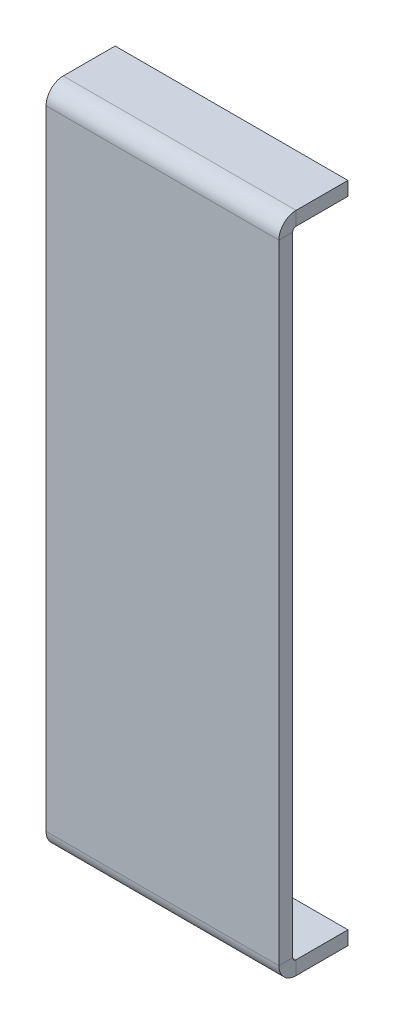
ISO-10303-21;
HEADER;
FILE_DESCRIPTION(('STEP AP214'),'2;1');
FILE_NAME('part.step','',(''),(''),'','','');
FILE_SCHEMA(('AUTOMOTIVE_DESIGN { 1 0 10303 214 1 1 1 1 }'));
ENDSEC;
DATA;
#1=APPLICATION_CONTEXT('core data for automotive mechanical design processes');
#2=APPLICATION_PROTOCOL_DEFINITION('international standard','automotive_design',2000,#1);
#3=PRODUCT_CONTEXT('',#1,'mechanical');
#4=PRODUCT('Part','Part','',(#3));
#5=PRODUCT_RELATED_PRODUCT_CATEGORY('part','',(#4));
#6=PRODUCT_DEFINITION_FORMATION('','',#4);
#7=PRODUCT_DEFINITION_CONTEXT('part definition',#1,'design');
#8=PRODUCT_DEFINITION('design','',#6,#7);
#9=PRODUCT_DEFINITION_SHAPE('','',#8);
#10=(LENGTH_UNIT() NAMED_UNIT(*) SI_UNIT(.MILLI.,.METRE.));
#11=(NAMED_UNIT(*) PLANE_ANGLE_UNIT() SI_UNIT($,.RADIAN.));
#12=(NAMED_UNIT(*) SI_UNIT($,.STERADIAN.) SOLID_ANGLE_UNIT());
#13=UNCERTAINTY_MEASURE_WITH_UNIT(LENGTH_MEASURE(1.E-05),#10,'distance_accuracy_value','');
#14=(GEOMETRIC_REPRESENTATION_CONTEXT(3) GLOBAL_UNCERTAINTY_ASSIGNED_CONTEXT((#13)) GLOBAL_UNIT_ASSIGNED_CONTEXT((#10,
#11,#12)) REPRESENTATION_CONTEXT('',''));
#15=CARTESIAN_POINT('',(0.,0.,0.));
#16=DIRECTION('',(0.,0.,1.));
#17=DIRECTION('',(1.,0.,0.));
#18=AXIS2_PLACEMENT_3D('',#15,#16,#17);
#19=CARTESIAN_POINT('',(0.,0.,-3.));
#20=DIRECTION('',(0.,0.,-1.));
#21=DIRECTION('',(-1.,0.,0.));
#22=AXIS2_PLACEMENT_3D('',#19,#20,#21);
#23=PLANE('',#22);
#24=DIRECTION('',(0.,-1.,0.));
#25=VECTOR('',#24,1.);
#26=CARTESIAN_POINT('',(21.2961569521701,97.8878461197995,-3.));
#27=LINE('',#26,#25);
#28=CARTESIAN_POINT('',(21.2961569521701,94.1512461197995,-3.00000000000001));
#29=VERTEX_POINT('',#28);
#30=CARTESIAN_POINT('',(21.2961569521701,-42.3755538802005,-3.));
#31=VERTEX_POINT('',#30);
#32=EDGE_CURVE('E96',#29,#31,#27,.T.);
#33=ORIENTED_EDGE('',*,*,#32,.F.);
#34=DIRECTION('',(1.,0.,0.));
#35=VECTOR('',#34,1.);
#36=CARTESIAN_POINT('',(71.8770273568939,94.1512461197995,-3.00000000000001));
#37=LINE('',#36,#35);
#38=CARTESIAN_POINT('',(71.8770273568939,94.1512461197995,-3.00000000000001));
#39=VERTEX_POINT('',#38);
#40=EDGE_CURVE('E274',#39,#29,#37,.F.);
#41=ORIENTED_EDGE('',*,*,#40,.F.);
#42=DIRECTION('',(0.,1.,0.));
#43=VECTOR('',#42,1.);
#44=CARTESIAN_POINT('',(71.8770273568939,97.8878461197995,-3.));
#45=LINE('',#44,#43);
#46=CARTESIAN_POINT('',(71.877027356894,-42.3755538802005,-3.));
#47=VERTEX_POINT('',#46);
#48=EDGE_CURVE('E13',#47,#39,#45,.T.);
#49=ORIENTED_EDGE('',*,*,#48,.F.);
#50=DIRECTION('',(-1.,0.,0.));
#51=VECTOR('',#50,1.);
#52=CARTESIAN_POINT('',(21.2961569521701,-42.3755538802005,-3.00000000000001));
#53=LINE('',#52,#51);
#54=EDGE_CURVE('E342',#31,#47,#53,.F.);
#55=ORIENTED_EDGE('',*,*,#54,.F.);
#56=EDGE_LOOP('',(#33,#41,#49,#55));
#57=FACE_BOUND('',#56,.T.);
#58=ADVANCED_FACE('F86',(#57),#23,.T.);
#59=CARTESIAN_POINT('',(0.,0.,0.));
#60=DIRECTION('',(0.,0.,-1.));
#61=DIRECTION('',(-1.,0.,0.));
#62=AXIS2_PLACEMENT_3D('',#59,#60,#61);
#63=PLANE('',#62);
#64=DIRECTION('',(1.,0.,0.));
#65=VECTOR('',#64,1.);
#66=CARTESIAN_POINT('',(71.8770273568939,94.1512461197995,0.));
#67=LINE('',#66,#65);
#68=CARTESIAN_POINT('',(71.8770273568939,94.1512461197995,0.));
#69=VERTEX_POINT('',#68);
#70=CARTESIAN_POINT('',(21.2961569521701,94.1512461197995,0.));
#71=VERTEX_POINT('',#70);
#72=EDGE_CURVE('E258',#69,#71,#67,.F.);
#73=ORIENTED_EDGE('',*,*,#72,.T.);
#74=DIRECTION('',(0.,-1.,0.));
#75=VECTOR('',#74,1.);
#76=CARTESIAN_POINT('',(21.2961569521701,97.8878461197995,0.));
#77=LINE('',#76,#75);
#78=CARTESIAN_POINT('',(21.2961569521701,-42.3755538802005,0.));
#79=VERTEX_POINT('',#78);
#80=EDGE_CURVE('E350',#71,#79,#77,.T.);
#81=ORIENTED_EDGE('',*,*,#80,.T.);
#82=DIRECTION('',(-1.,0.,0.));
#83=VECTOR('',#82,1.);
#84=CARTESIAN_POINT('',(21.2961569521701,-42.3755538802005,0.));
#85=LINE('',#84,#83);
#86=CARTESIAN_POINT('',(71.877027356894,-42.3755538802005,0.));
#87=VERTEX_POINT('',#86);
#88=EDGE_CURVE('E326',#79,#87,#85,.F.);
#89=ORIENTED_EDGE('',*,*,#88,.T.);
#90=DIRECTION('',(0.,1.,0.));
#91=VECTOR('',#90,1.);
#92=CARTESIAN_POINT('',(71.8770273568939,97.8878461197995,0.));
#93=LINE('',#92,#91);
#94=EDGE_CURVE('E90',#87,#69,#93,.T.);
#95=ORIENTED_EDGE('',*,*,#94,.T.);
#96=EDGE_LOOP('',(#73,#81,#89,#95));
#97=FACE_BOUND('',#96,.T.);
#98=ADVANCED_FACE('F359',(#97),#63,.F.);
#99=CARTESIAN_POINT('',(71.8770273568939,97.8878461197995,-3.));
#100=DIRECTION('',(1.,0.,0.));
#101=DIRECTION('',(0.,1.,0.));
#102=AXIS2_PLACEMENT_3D('',#99,#100,#101);
#103=PLANE('',#102);
#104=ORIENTED_EDGE('',*,*,#48,.T.);
#105=DIRECTION('',(0.,0.,1.));
#106=VECTOR('',#105,1.);
#107=CARTESIAN_POINT('',(71.8770273568939,94.1512461197995,-3.00000000000001));
#108=LINE('',#107,#106);
#109=EDGE_CURVE('E266',#39,#69,#108,.T.);
#110=ORIENTED_EDGE('',*,*,#109,.T.);
#111=ORIENTED_EDGE('',*,*,#94,.F.);
#112=DIRECTION('',(0.,0.,1.));
#113=VECTOR('',#112,1.);
#114=CARTESIAN_POINT('',(71.8770273568939,-42.3755538802005,-3.00000000000001));
#115=LINE('',#114,#113);
#116=EDGE_CURVE('E107',#47,#87,#115,.T.);
#117=ORIENTED_EDGE('',*,*,#116,.F.);
#118=EDGE_LOOP('',(#104,#110,#111,#117));
#119=FACE_BOUND('',#118,.T.);
#120=ADVANCED_FACE('F363',(#119),#103,.T.);
#121=CARTESIAN_POINT('',(21.2961569521701,97.8878461197995,-3.));
#122=DIRECTION('',(-1.,0.,0.));
#123=DIRECTION('',(0.,-1.,0.));
#124=AXIS2_PLACEMENT_3D('',#121,#122,#123);
#125=PLANE('',#124);
#126=DIRECTION('',(0.,0.,1.));
#127=VECTOR('',#126,1.);
#128=CARTESIAN_POINT('',(21.2961569521701,94.1512461197995,-3.00000000000001));
#129=LINE('',#128,#127);
#130=EDGE_CURVE('E282',#29,#71,#129,.T.);
#131=ORIENTED_EDGE('',*,*,#130,.F.);
#132=ORIENTED_EDGE('',*,*,#32,.T.);
#133=DIRECTION('',(0.,0.,1.));
#134=VECTOR('',#133,1.);
#135=CARTESIAN_POINT('',(21.2961569521701,-42.3755538802005,-3.00000000000001));
#136=LINE('',#135,#134);
#137=EDGE_CURVE('E334',#31,#79,#136,.T.);
#138=ORIENTED_EDGE('',*,*,#137,.T.);
#139=ORIENTED_EDGE('',*,*,#80,.F.);
#140=EDGE_LOOP('',(#131,#132,#138,#139));
#141=FACE_BOUND('',#140,.T.);
#142=ADVANCED_FACE('F88',(#141),#125,.T.);
#143=CARTESIAN_POINT('',(71.8770273568939,-42.3755538802005,-3.7366));
#144=DIRECTION('',(1.,0.,0.));
#145=DIRECTION('',(0.,0.,-1.));
#146=AXIS2_PLACEMENT_3D('',#143,#144,#145);
#147=PLANE('',#146);
#148=DIRECTION('',(0.,1.,0.));
#149=VECTOR('',#148,1.);
#150=CARTESIAN_POINT('',(71.877027356894,-46.1121538802005,-3.73659999999999));
#151=LINE('',#150,#149);
#152=CARTESIAN_POINT('',(71.8770273568939,-43.1121538802005,-3.7366));
#153=VERTEX_POINT('',#152);
#154=CARTESIAN_POINT('',(71.8770273568939,-46.1121538802005,-3.73659999999999));
#155=VERTEX_POINT('',#154);
#156=EDGE_CURVE('E285',#153,#155,#151,.F.);
#157=ORIENTED_EDGE('',*,*,#156,.F.);
#158=CARTESIAN_POINT('',(71.8770273568939,-42.3755538802005,-3.7366));
#159=DIRECTION('',(-1.,0.,0.));
#160=DIRECTION('',(0.,0.,1.));
#161=AXIS2_PLACEMENT_3D('',#158,#159,#160);
#162=CIRCLE('',#161,0.736599999999997);
#163=EDGE_CURVE('E338',#47,#153,#162,.F.);
#164=ORIENTED_EDGE('',*,*,#163,.F.);
#165=ORIENTED_EDGE('',*,*,#116,.T.);
#166=CARTESIAN_POINT('',(71.8770273568939,-42.3755538802005,-3.7366));
#167=DIRECTION('',(-1.,0.,0.));
#168=DIRECTION('',(0.,0.,1.));
#169=AXIS2_PLACEMENT_3D('',#166,#167,#168);
#170=CIRCLE('',#169,3.7366);
#171=EDGE_CURVE('E329',#87,#155,#170,.F.);
#172=ORIENTED_EDGE('',*,*,#171,.T.);
#173=EDGE_LOOP('',(#157,#164,#165,#172));
#174=FACE_BOUND('',#173,.T.);
#175=ADVANCED_FACE('F415',(#174),#147,.T.);
#176=CARTESIAN_POINT('',(21.2961569521701,-42.3755538802005,-3.7366));
#177=DIRECTION('',(1.,0.,0.));
#178=DIRECTION('',(0.,0.,-1.));
#179=AXIS2_PLACEMENT_3D('',#176,#177,#178);
#180=PLANE('',#179);
#181=CARTESIAN_POINT('',(21.2961569521701,-42.3755538802005,-3.7366));
#182=DIRECTION('',(-1.,0.,0.));
#183=DIRECTION('',(0.,0.,1.));
#184=AXIS2_PLACEMENT_3D('',#181,#182,#183);
#185=CIRCLE('',#184,0.736599999999997);
#186=CARTESIAN_POINT('',(21.2961569521701,-43.1121538802005,-3.7366));
#187=VERTEX_POINT('',#186);
#188=EDGE_CURVE('E291',#187,#31,#185,.T.);
#189=ORIENTED_EDGE('',*,*,#188,.F.);
#190=DIRECTION('',(0.,1.,0.));
#191=VECTOR('',#190,1.);
#192=CARTESIAN_POINT('',(21.2961569521701,-43.1121538802005,-3.7366));
#193=LINE('',#192,#191);
#194=CARTESIAN_POINT('',(21.2961569521701,-46.1121538802005,-3.73659999999999));
#195=VERTEX_POINT('',#194);
#196=EDGE_CURVE('E318',#187,#195,#193,.F.);
#197=ORIENTED_EDGE('',*,*,#196,.T.);
#198=CARTESIAN_POINT('',(21.2961569521701,-42.3755538802005,-3.7366));
#199=DIRECTION('',(-1.,0.,0.));
#200=DIRECTION('',(0.,0.,1.));
#201=AXIS2_PLACEMENT_3D('',#198,#199,#200);
#202=CIRCLE('',#201,3.7366);
#203=EDGE_CURVE('E330',#195,#79,#202,.T.);
#204=ORIENTED_EDGE('',*,*,#203,.T.);
#205=ORIENTED_EDGE('',*,*,#137,.F.);
#206=EDGE_LOOP('',(#189,#197,#204,#205));
#207=FACE_BOUND('',#206,.T.);
#208=ADVANCED_FACE('F388',(#207),#180,.F.);
#209=CARTESIAN_POINT('',(21.2961569521701,-42.3755538802005,-3.7366));
#210=DIRECTION('',(-1.,0.,0.));
#211=DIRECTION('',(0.,-1.,0.));
#212=AXIS2_PLACEMENT_3D('',#209,#210,#211);
#213=CYLINDRICAL_SURFACE('',#212,3.7366);
#214=ORIENTED_EDGE('',*,*,#88,.F.);
#215=ORIENTED_EDGE('',*,*,#203,.F.);
#216=DIRECTION('',(-1.,0.,0.));
#217=VECTOR('',#216,1.);
#218=CARTESIAN_POINT('',(71.877027356894,-46.1121538802005,-3.73659999999999));
#219=LINE('',#218,#217);
#220=EDGE_CURVE('E315',#195,#155,#219,.F.);
#221=ORIENTED_EDGE('',*,*,#220,.T.);
#222=ORIENTED_EDGE('',*,*,#171,.F.);
#223=EDGE_LOOP('',(#214,#215,#221,#222));
#224=FACE_BOUND('',#223,.T.);
#225=ADVANCED_FACE('F413',(#224),#213,.T.);
#226=CARTESIAN_POINT('',(21.2961569521701,-42.3755538802005,-3.7366));
#227=DIRECTION('',(-1.,0.,0.));
#228=DIRECTION('',(0.,-1.,0.));
#229=AXIS2_PLACEMENT_3D('',#226,#227,#228);
#230=CYLINDRICAL_SURFACE('',#229,0.736599999999997);
#231=ORIENTED_EDGE('',*,*,#54,.T.);
#232=ORIENTED_EDGE('',*,*,#163,.T.);
#233=DIRECTION('',(-1.,0.,0.));
#234=VECTOR('',#233,1.);
#235=CARTESIAN_POINT('',(71.877027356894,-43.1121538802005,-3.7366));
#236=LINE('',#235,#234);
#237=EDGE_CURVE('E321',#153,#187,#236,.T.);
#238=ORIENTED_EDGE('',*,*,#237,.T.);
#239=ORIENTED_EDGE('',*,*,#188,.T.);
#240=EDGE_LOOP('',(#231,#232,#238,#239));
#241=FACE_BOUND('',#240,.T.);
#242=ADVANCED_FACE('F390',(#241),#230,.F.);
#243=CARTESIAN_POINT('',(21.2961569521701,-46.1121538802006,-15.));
#244=DIRECTION('',(1.,0.,0.));
#245=DIRECTION('',(0.,0.,-1.));
#246=AXIS2_PLACEMENT_3D('',#243,#244,#245);
#247=PLANE('',#246);
#248=ORIENTED_EDGE('',*,*,#196,.F.);
#249=DIRECTION('',(0.,0.,1.));
#250=VECTOR('',#249,1.);
#251=CARTESIAN_POINT('',(21.2961569521701,-43.1121538802006,-15.));
#252=LINE('',#251,#250);
#253=CARTESIAN_POINT('',(21.2961569521701,-43.1121538802006,-15.));
#254=VERTEX_POINT('',#253);
#255=EDGE_CURVE('E312',#187,#254,#252,.F.);
#256=ORIENTED_EDGE('',*,*,#255,.T.);
#257=DIRECTION('',(0.,1.,0.));
#258=VECTOR('',#257,1.);
#259=CARTESIAN_POINT('',(21.2961569521701,-46.1121538802006,-15.));
#260=LINE('',#259,#258);
#261=CARTESIAN_POINT('',(21.2961569521701,-46.1121538802006,-15.));
#262=VERTEX_POINT('',#261);
#263=EDGE_CURVE('E288',#262,#254,#260,.T.);
#264=ORIENTED_EDGE('',*,*,#263,.F.);
#265=DIRECTION('',(0.,0.,-1.));
#266=VECTOR('',#265,1.);
#267=CARTESIAN_POINT('',(21.2961569521701,-46.1121538802005,1.70458115744207E-13));
#268=LINE('',#267,#266);
#269=EDGE_CURVE('E302',#195,#262,#268,.T.);
#270=ORIENTED_EDGE('',*,*,#269,.F.);
#271=EDGE_LOOP('',(#248,#256,#264,#270));
#272=FACE_BOUND('',#271,.T.);
#273=ADVANCED_FACE('F407',(#272),#247,.F.);
#274=CARTESIAN_POINT('',(71.877027356894,-46.1121538802005,-2.99999999999999));
#275=DIRECTION('',(-1.,0.,0.));
#276=DIRECTION('',(0.,0.,1.));
#277=AXIS2_PLACEMENT_3D('',#274,#275,#276);
#278=PLANE('',#277);
#279=ORIENTED_EDGE('',*,*,#156,.T.);
#280=DIRECTION('',(0.,0.,1.));
#281=VECTOR('',#280,1.);
#282=CARTESIAN_POINT('',(71.877027356894,-46.1121538802005,1.70458115744207E-13));
#283=LINE('',#282,#281);
#284=CARTESIAN_POINT('',(71.877027356894,-46.1121538802006,-15.));
#285=VERTEX_POINT('',#284);
#286=EDGE_CURVE('E295',#285,#155,#283,.T.);
#287=ORIENTED_EDGE('',*,*,#286,.F.);
#288=DIRECTION('',(0.,1.,0.));
#289=VECTOR('',#288,1.);
#290=CARTESIAN_POINT('',(71.877027356894,-46.1121538802006,-15.));
#291=LINE('',#290,#289);
#292=CARTESIAN_POINT('',(71.877027356894,-43.1121538802006,-15.));
#293=VERTEX_POINT('',#292);
#294=EDGE_CURVE('E292',#285,#293,#291,.T.);
#295=ORIENTED_EDGE('',*,*,#294,.T.);
#296=DIRECTION('',(0.,0.,-1.));
#297=VECTOR('',#296,1.);
#298=CARTESIAN_POINT('',(71.877027356894,-43.1121538802005,-3.));
#299=LINE('',#298,#297);
#300=EDGE_CURVE('E305',#293,#153,#299,.F.);
#301=ORIENTED_EDGE('',*,*,#300,.T.);
#302=EDGE_LOOP('',(#279,#287,#295,#301));
#303=FACE_BOUND('',#302,.T.);
#304=ADVANCED_FACE('F398',(#303),#278,.F.);
#305=CARTESIAN_POINT('',(0.,-46.1121538802005,1.70458115744207E-13));
#306=DIRECTION('',(0.,1.,0.));
#307=DIRECTION('',(0.,0.,1.));
#308=AXIS2_PLACEMENT_3D('',#305,#306,#307);
#309=PLANE('',#308);
#310=ORIENTED_EDGE('',*,*,#220,.F.);
#311=ORIENTED_EDGE('',*,*,#269,.T.);
#312=DIRECTION('',(1.,0.,0.));
#313=VECTOR('',#312,1.);
#314=CARTESIAN_POINT('',(0.,-46.1121538802006,-15.));
#315=LINE('',#314,#313);
#316=EDGE_CURVE('E299',#262,#285,#315,.T.);
#317=ORIENTED_EDGE('',*,*,#316,.T.);
#318=ORIENTED_EDGE('',*,*,#286,.T.);
#319=EDGE_LOOP('',(#310,#311,#317,#318));
#320=FACE_BOUND('',#319,.T.);
#321=ADVANCED_FACE('F410',(#320),#309,.F.);
#322=CARTESIAN_POINT('',(0.,-43.1121538802005,1.59983671727678E-13));
#323=DIRECTION('',(0.,1.,0.));
#324=DIRECTION('',(0.,0.,1.));
#325=AXIS2_PLACEMENT_3D('',#322,#323,#324);
#326=PLANE('',#325);
#327=ORIENTED_EDGE('',*,*,#255,.F.);
#328=ORIENTED_EDGE('',*,*,#237,.F.);
#329=ORIENTED_EDGE('',*,*,#300,.F.);
#330=DIRECTION('',(-1.,0.,0.));
#331=VECTOR('',#330,1.);
#332=CARTESIAN_POINT('',(71.877027356894,-43.1121538802006,-15.));
#333=LINE('',#332,#331);
#334=EDGE_CURVE('E309',#254,#293,#333,.F.);
#335=ORIENTED_EDGE('',*,*,#334,.F.);
#336=EDGE_LOOP('',(#327,#328,#329,#335));
#337=FACE_BOUND('',#336,.T.);
#338=ADVANCED_FACE('F395',(#337),#326,.T.);
#339=CARTESIAN_POINT('',(71.877027356894,-46.1121538802006,-15.));
#340=DIRECTION('',(0.,0.,1.));
#341=DIRECTION('',(0.,-1.,0.));
#342=AXIS2_PLACEMENT_3D('',#339,#340,#341);
#343=PLANE('',#342);
#344=ORIENTED_EDGE('',*,*,#334,.T.);
#345=ORIENTED_EDGE('',*,*,#294,.F.);
#346=ORIENTED_EDGE('',*,*,#316,.F.);
#347=ORIENTED_EDGE('',*,*,#263,.T.);
#348=EDGE_LOOP('',(#344,#345,#346,#347));
#349=FACE_BOUND('',#348,.T.);
#350=ADVANCED_FACE('F403',(#349),#343,.F.);
#351=CARTESIAN_POINT('',(21.2961569521701,94.1512461197995,-3.73660000000001));
#352=DIRECTION('',(-1.,0.,0.));
#353=DIRECTION('',(0.,0.,1.));
#354=AXIS2_PLACEMENT_3D('',#351,#352,#353);
#355=PLANE('',#354);
#356=DIRECTION('',(0.,-1.,0.));
#357=VECTOR('',#356,1.);
#358=CARTESIAN_POINT('',(21.2961569521701,97.8878461197995,-3.7366));
#359=LINE('',#358,#357);
#360=CARTESIAN_POINT('',(21.2961569521701,94.8878461197995,-3.73660000000001));
#361=VERTEX_POINT('',#360);
#362=CARTESIAN_POINT('',(21.2961569521701,97.8878461197995,-3.7366));
#363=VERTEX_POINT('',#362);
#364=EDGE_CURVE('E232',#361,#363,#359,.F.);
#365=ORIENTED_EDGE('',*,*,#364,.F.);
#366=CARTESIAN_POINT('',(21.2961569521701,94.1512461197995,-3.73660000000001));
#367=DIRECTION('',(1.,0.,0.));
#368=DIRECTION('',(0.,0.,-1.));
#369=AXIS2_PLACEMENT_3D('',#366,#367,#368);
#370=CIRCLE('',#369,0.736600000000004);
#371=EDGE_CURVE('E270',#29,#361,#370,.F.);
#372=ORIENTED_EDGE('',*,*,#371,.F.);
#373=ORIENTED_EDGE('',*,*,#130,.T.);
#374=CARTESIAN_POINT('',(21.2961569521701,94.1512461197995,-3.73660000000001));
#375=DIRECTION('',(1.,0.,0.));
#376=DIRECTION('',(0.,0.,-1.));
#377=AXIS2_PLACEMENT_3D('',#374,#375,#376);
#378=CIRCLE('',#377,3.7366);
#379=EDGE_CURVE('E261',#71,#363,#378,.F.);
#380=ORIENTED_EDGE('',*,*,#379,.T.);
#381=EDGE_LOOP('',(#365,#372,#373,#380));
#382=FACE_BOUND('',#381,.T.);
#383=ADVANCED_FACE('F381',(#382),#355,.T.);
#384=CARTESIAN_POINT('',(71.8770273568939,94.1512461197995,-3.73660000000001));
#385=DIRECTION('',(-1.,0.,0.));
#386=DIRECTION('',(0.,0.,1.));
#387=AXIS2_PLACEMENT_3D('',#384,#385,#386);
#388=PLANE('',#387);
#389=CARTESIAN_POINT('',(71.8770273568939,94.1512461197995,-3.73660000000001));
#390=DIRECTION('',(1.,0.,0.));
#391=DIRECTION('',(0.,0.,-1.));
#392=AXIS2_PLACEMENT_3D('',#389,#390,#391);
#393=CIRCLE('',#392,0.736600000000004);
#394=CARTESIAN_POINT('',(71.8770273568939,94.8878461197995,-3.73660000000001));
#395=VERTEX_POINT('',#394);
#396=EDGE_CURVE('E278',#395,#39,#393,.T.);
#397=ORIENTED_EDGE('',*,*,#396,.F.);
#398=DIRECTION('',(0.,-1.,0.));
#399=VECTOR('',#398,1.);
#400=CARTESIAN_POINT('',(71.8770273568939,94.8878461197995,-3.73660000000001));
#401=LINE('',#400,#399);
#402=CARTESIAN_POINT('',(71.8770273568939,97.8878461197995,-3.7366));
#403=VERTEX_POINT('',#402);
#404=EDGE_CURVE('E251',#395,#403,#401,.F.);
#405=ORIENTED_EDGE('',*,*,#404,.T.);
#406=CARTESIAN_POINT('',(71.8770273568939,94.1512461197995,-3.73660000000001));
#407=DIRECTION('',(1.,0.,0.));
#408=DIRECTION('',(0.,0.,-1.));
#409=AXIS2_PLACEMENT_3D('',#406,#407,#408);
#410=CIRCLE('',#409,3.7366);
#411=EDGE_CURVE('E262',#403,#69,#410,.T.);
#412=ORIENTED_EDGE('',*,*,#411,.T.);
#413=ORIENTED_EDGE('',*,*,#109,.F.);
#414=EDGE_LOOP('',(#397,#405,#412,#413));
#415=FACE_BOUND('',#414,.T.);
#416=ADVANCED_FACE('F369',(#415),#388,.F.);
#417=CARTESIAN_POINT('',(71.8770273568939,94.1512461197995,-3.73660000000001));
#418=DIRECTION('',(1.,0.,0.));
#419=DIRECTION('',(0.,1.,0.));
#420=AXIS2_PLACEMENT_3D('',#417,#418,#419);
#421=CYLINDRICAL_SURFACE('',#420,3.7366);
#422=ORIENTED_EDGE('',*,*,#72,.F.);
#423=ORIENTED_EDGE('',*,*,#411,.F.);
#424=DIRECTION('',(1.,0.,0.));
#425=VECTOR('',#424,1.);
#426=CARTESIAN_POINT('',(21.2961569521701,97.8878461197995,-3.7366));
#427=LINE('',#426,#425);
#428=EDGE_CURVE('E248',#403,#363,#427,.F.);
#429=ORIENTED_EDGE('',*,*,#428,.T.);
#430=ORIENTED_EDGE('',*,*,#379,.F.);
#431=EDGE_LOOP('',(#422,#423,#429,#430));
#432=FACE_BOUND('',#431,.T.);
#433=ADVANCED_FACE('F368',(#432),#421,.T.);
#434=CARTESIAN_POINT('',(71.8770273568939,94.1512461197995,-3.73660000000001));
#435=DIRECTION('',(1.,0.,0.));
#436=DIRECTION('',(0.,1.,0.));
#437=AXIS2_PLACEMENT_3D('',#434,#435,#436);
#438=CYLINDRICAL_SURFACE('',#437,0.736600000000004);
#439=ORIENTED_EDGE('',*,*,#40,.T.);
#440=ORIENTED_EDGE('',*,*,#371,.T.);
#441=DIRECTION('',(1.,0.,0.));
#442=VECTOR('',#441,1.);
#443=CARTESIAN_POINT('',(21.2961569521701,94.8878461197995,-3.73660000000001));
#444=LINE('',#443,#442);
#445=EDGE_CURVE('E254',#361,#395,#444,.T.);
#446=ORIENTED_EDGE('',*,*,#445,.T.);
#447=ORIENTED_EDGE('',*,*,#396,.T.);
#448=EDGE_LOOP('',(#439,#440,#446,#447));
#449=FACE_BOUND('',#448,.T.);
#450=ADVANCED_FACE('F378',(#449),#438,.F.);
#451=CARTESIAN_POINT('',(71.8770273568939,97.8878461197995,-15.));
#452=DIRECTION('',(-1.,0.,0.));
#453=DIRECTION('',(0.,0.,1.));
#454=AXIS2_PLACEMENT_3D('',#451,#452,#453);
#455=PLANE('',#454);
#456=ORIENTED_EDGE('',*,*,#404,.F.);
#457=DIRECTION('',(0.,0.,1.));
#458=VECTOR('',#457,1.);
#459=CARTESIAN_POINT('',(71.8770273568939,94.8878461197995,-15.));
#460=LINE('',#459,#458);
#461=CARTESIAN_POINT('',(71.8770273568939,94.8878461197995,-15.));
#462=VERTEX_POINT('',#461);
#463=EDGE_CURVE('E245',#395,#462,#460,.F.);
#464=ORIENTED_EDGE('',*,*,#463,.T.);
#465=DIRECTION('',(0.,-1.,0.));
#466=VECTOR('',#465,1.);
#467=CARTESIAN_POINT('',(71.8770273568939,97.8878461197995,-15.));
#468=LINE('',#467,#466);
#469=CARTESIAN_POINT('',(71.8770273568939,97.8878461197995,-15.));
#470=VERTEX_POINT('',#469);
#471=EDGE_CURVE('E228',#470,#462,#468,.T.);
#472=ORIENTED_EDGE('',*,*,#471,.F.);
#473=DIRECTION('',(0.,0.,-1.));
#474=VECTOR('',#473,1.);
#475=CARTESIAN_POINT('',(71.8770273568939,97.8878461197994,3.50091133370172E-13));
#476=LINE('',#475,#474);
#477=EDGE_CURVE('E214',#403,#470,#476,.T.);
#478=ORIENTED_EDGE('',*,*,#477,.F.);
#479=EDGE_LOOP('',(#456,#464,#472,#478));
#480=FACE_BOUND('',#479,.T.);
#481=ADVANCED_FACE('F373',(#480),#455,.F.);
#482=CARTESIAN_POINT('',(21.2961569521701,97.8878461197995,-2.99999999999999));
#483=DIRECTION('',(1.,0.,0.));
#484=DIRECTION('',(0.,0.,-1.));
#485=AXIS2_PLACEMENT_3D('',#482,#483,#484);
#486=PLANE('',#485);
#487=ORIENTED_EDGE('',*,*,#364,.T.);
#488=DIRECTION('',(0.,0.,1.));
#489=VECTOR('',#488,1.);
#490=CARTESIAN_POINT('',(21.2961569521701,97.8878461197994,3.50091133370172E-13));
#491=LINE('',#490,#489);
#492=CARTESIAN_POINT('',(21.2961569521701,97.8878461197995,-15.));
#493=VERTEX_POINT('',#492);
#494=EDGE_CURVE('E212',#493,#363,#491,.T.);
#495=ORIENTED_EDGE('',*,*,#494,.F.);
#496=DIRECTION('',(0.,-1.,0.));
#497=VECTOR('',#496,1.);
#498=CARTESIAN_POINT('',(21.2961569521701,97.8878461197995,-15.));
#499=LINE('',#498,#497);
#500=CARTESIAN_POINT('',(21.2961569521701,94.8878461197995,-15.));
#501=VERTEX_POINT('',#500);
#502=EDGE_CURVE('E221',#493,#501,#499,.T.);
#503=ORIENTED_EDGE('',*,*,#502,.T.);
#504=DIRECTION('',(0.,0.,-1.));
#505=VECTOR('',#504,1.);
#506=CARTESIAN_POINT('',(21.2961569521701,94.8878461197995,-3.));
#507=LINE('',#506,#505);
#508=EDGE_CURVE('E241',#501,#361,#507,.F.);
#509=ORIENTED_EDGE('',*,*,#508,.T.);
#510=EDGE_LOOP('',(#487,#495,#503,#509));
#511=FACE_BOUND('',#510,.T.);
#512=ADVANCED_FACE('F231',(#511),#486,.F.);
#513=CARTESIAN_POINT('',(0.,97.8878461197994,3.50091133370172E-13));
#514=DIRECTION('',(0.,-1.,0.));
#515=DIRECTION('',(0.,0.,-1.));
#516=AXIS2_PLACEMENT_3D('',#513,#514,#515);
#517=PLANE('',#516);
#518=ORIENTED_EDGE('',*,*,#428,.F.);
#519=ORIENTED_EDGE('',*,*,#477,.T.);
#520=DIRECTION('',(-1.,0.,0.));
#521=VECTOR('',#520,1.);
#522=CARTESIAN_POINT('',(0.,97.8878461197995,-15.));
#523=LINE('',#522,#521);
#524=EDGE_CURVE('E207',#470,#493,#523,.T.);
#525=ORIENTED_EDGE('',*,*,#524,.T.);
#526=ORIENTED_EDGE('',*,*,#494,.T.);
#527=EDGE_LOOP('',(#518,#519,#525,#526));
#528=FACE_BOUND('',#527,.T.);
#529=ADVANCED_FACE('F210',(#528),#517,.F.);
#530=CARTESIAN_POINT('',(0.,94.8878461197994,3.39616689353642E-13));
#531=DIRECTION('',(0.,-1.,0.));
#532=DIRECTION('',(0.,0.,-1.));
#533=AXIS2_PLACEMENT_3D('',#530,#531,#532);
#534=PLANE('',#533);
#535=ORIENTED_EDGE('',*,*,#463,.F.);
#536=ORIENTED_EDGE('',*,*,#445,.F.);
#537=ORIENTED_EDGE('',*,*,#508,.F.);
#538=DIRECTION('',(1.,0.,0.));
#539=VECTOR('',#538,1.);
#540=CARTESIAN_POINT('',(21.2961569521701,94.8878461197995,-15.));
#541=LINE('',#540,#539);
#542=EDGE_CURVE('E224',#462,#501,#541,.F.);
#543=ORIENTED_EDGE('',*,*,#542,.F.);
#544=EDGE_LOOP('',(#535,#536,#537,#543));
#545=FACE_BOUND('',#544,.T.);
#546=ADVANCED_FACE('F376',(#545),#534,.T.);
#547=CARTESIAN_POINT('',(21.2961569521701,97.8878461197995,-15.));
#548=DIRECTION('',(0.,0.,1.));
#549=DIRECTION('',(0.,-1.,0.));
#550=AXIS2_PLACEMENT_3D('',#547,#548,#549);
#551=PLANE('',#550);
#552=ORIENTED_EDGE('',*,*,#542,.T.);
#553=ORIENTED_EDGE('',*,*,#502,.F.);
#554=ORIENTED_EDGE('',*,*,#524,.F.);
#555=ORIENTED_EDGE('',*,*,#471,.T.);
#556=EDGE_LOOP('',(#552,#553,#554,#555));
#557=FACE_BOUND('',#556,.T.);
#558=ADVANCED_FACE('F222',(#557),#551,.F.);
#559=CLOSED_SHELL('',(#58,#98,#120,#142,#175,#208,#225,#242,#273,#304,#321,#338,#350,#383,#416,
#433,#450,#481,#512,#529,#546,#558));
#560=MANIFOLD_SOLID_BREP('B2',#559);
#561=ADVANCED_BREP_SHAPE_REPRESENTATION('',(#18,#560),#14);
#562=SHAPE_DEFINITION_REPRESENTATION(#9,#561);
ENDSEC;
END-ISO-10303-21;
